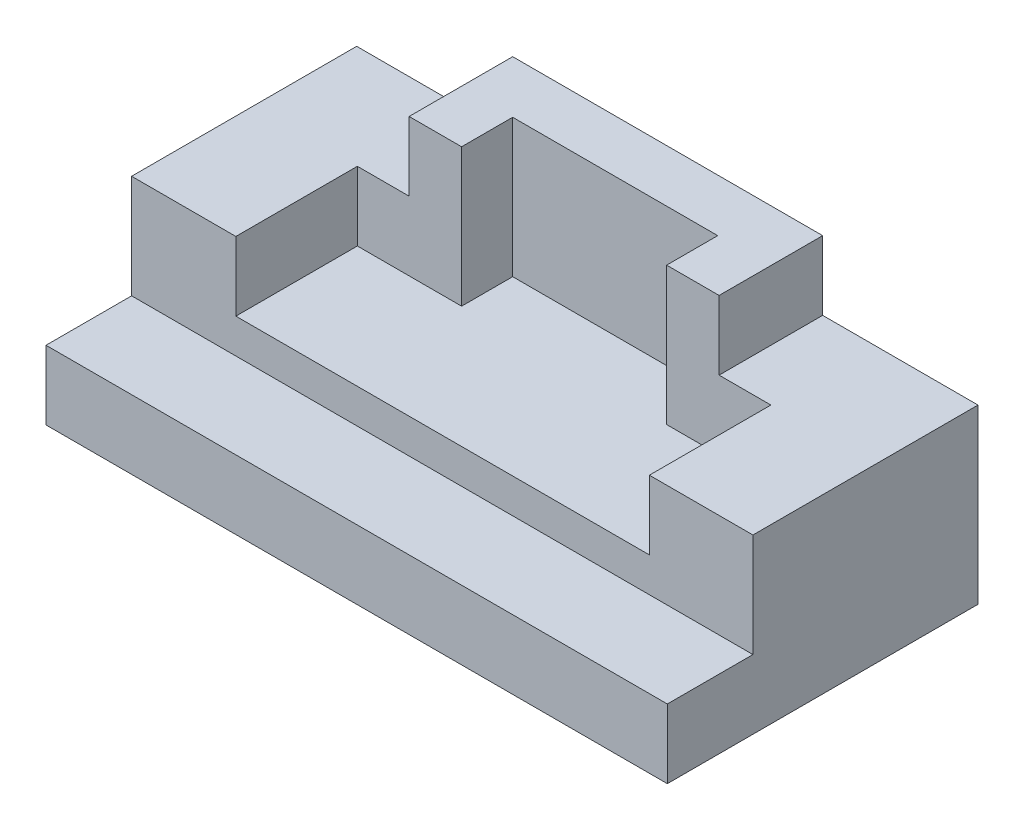
ISO-10303-21;
HEADER;
FILE_DESCRIPTION(('STEP AP214'),'2;1');
FILE_NAME('part.step','',(''),(''),'','','');
FILE_SCHEMA(('AUTOMOTIVE_DESIGN { 1 0 10303 214 1 1 1 1 }'));
ENDSEC;
DATA;
#1=APPLICATION_CONTEXT('core data for automotive mechanical design processes');
#2=APPLICATION_PROTOCOL_DEFINITION('international standard','automotive_design',2000,#1);
#3=PRODUCT_CONTEXT('',#1,'mechanical');
#4=PRODUCT('Part','Part','',(#3));
#5=PRODUCT_RELATED_PRODUCT_CATEGORY('part','',(#4));
#6=PRODUCT_DEFINITION_FORMATION('','',#4);
#7=PRODUCT_DEFINITION_CONTEXT('part definition',#1,'design');
#8=PRODUCT_DEFINITION('design','',#6,#7);
#9=PRODUCT_DEFINITION_SHAPE('','',#8);
#10=(LENGTH_UNIT() NAMED_UNIT(*) SI_UNIT(.MILLI.,.METRE.));
#11=(NAMED_UNIT(*) PLANE_ANGLE_UNIT() SI_UNIT($,.RADIAN.));
#12=(NAMED_UNIT(*) SI_UNIT($,.STERADIAN.) SOLID_ANGLE_UNIT());
#13=UNCERTAINTY_MEASURE_WITH_UNIT(LENGTH_MEASURE(1.E-05),#10,'distance_accuracy_value','');
#14=(GEOMETRIC_REPRESENTATION_CONTEXT(3) GLOBAL_UNCERTAINTY_ASSIGNED_CONTEXT((#13)) GLOBAL_UNIT_ASSIGNED_CONTEXT((#10,
#11,#12)) REPRESENTATION_CONTEXT('',''));
#15=CARTESIAN_POINT('',(0.,0.,0.));
#16=DIRECTION('',(0.,0.,1.));
#17=DIRECTION('',(1.,0.,0.));
#18=AXIS2_PLACEMENT_3D('',#15,#16,#17);
#19=CARTESIAN_POINT('',(57.15,31.75,-28.575));
#20=DIRECTION('',(0.,-1.,0.));
#21=DIRECTION('',(0.,0.,-1.));
#22=AXIS2_PLACEMENT_3D('',#19,#20,#21);
#23=PLANE('',#22);
#24=DIRECTION('',(0.,0.,-1.));
#25=VECTOR('',#24,1.);
#26=CARTESIAN_POINT('',(28.575,31.75,-28.575));
#27=LINE('',#26,#25);
#28=CARTESIAN_POINT('',(28.575,31.75,-9.52500000000001));
#29=VERTEX_POINT('',#28);
#30=CARTESIAN_POINT('',(28.575,31.75,-28.575));
#31=VERTEX_POINT('',#30);
#32=EDGE_CURVE('E213',#29,#31,#27,.T.);
#33=ORIENTED_EDGE('',*,*,#32,.F.);
#34=DIRECTION('',(1.,0.,0.));
#35=VECTOR('',#34,1.);
#36=CARTESIAN_POINT('',(57.15,31.75,-9.52500000000001));
#37=LINE('',#36,#35);
#38=CARTESIAN_POINT('',(38.1,31.75,-9.52500000000001));
#39=VERTEX_POINT('',#38);
#40=EDGE_CURVE('E197',#29,#39,#37,.T.);
#41=ORIENTED_EDGE('',*,*,#40,.T.);
#42=DIRECTION('',(0.,0.,1.));
#43=VECTOR('',#42,1.);
#44=CARTESIAN_POINT('',(38.1,31.75,-28.575));
#45=LINE('',#44,#43);
#46=CARTESIAN_POINT('',(38.1,31.75,12.827));
#47=VERTEX_POINT('',#46);
#48=EDGE_CURVE('E206',#39,#47,#45,.T.);
#49=ORIENTED_EDGE('',*,*,#48,.T.);
#50=DIRECTION('',(-1.,0.,0.));
#51=VECTOR('',#50,1.);
#52=CARTESIAN_POINT('',(57.15,31.75,12.827));
#53=LINE('',#52,#51);
#54=CARTESIAN_POINT('',(57.15,31.75,12.827));
#55=VERTEX_POINT('',#54);
#56=EDGE_CURVE('E288',#55,#47,#53,.T.);
#57=ORIENTED_EDGE('',*,*,#56,.F.);
#58=DIRECTION('',(0.,0.,1.));
#59=VECTOR('',#58,1.);
#60=CARTESIAN_POINT('',(57.15,31.75,-28.575));
#61=LINE('',#60,#59);
#62=CARTESIAN_POINT('',(57.15,31.75,-28.575));
#63=VERTEX_POINT('',#62);
#64=EDGE_CURVE('E253',#63,#55,#61,.T.);
#65=ORIENTED_EDGE('',*,*,#64,.F.);
#66=DIRECTION('',(-1.,0.,0.));
#67=VECTOR('',#66,1.);
#68=CARTESIAN_POINT('',(57.15,31.75,-28.575));
#69=LINE('',#68,#67);
#70=EDGE_CURVE('E11',#63,#31,#69,.T.);
#71=ORIENTED_EDGE('',*,*,#70,.T.);
#72=EDGE_LOOP('',(#33,#41,#49,#57,#65,#71));
#73=FACE_BOUND('',#72,.T.);
#74=ADVANCED_FACE('F33',(#73),#23,.F.);
#75=DIRECTION('',(0.,0.,-1.));
#76=VECTOR('',#75,1.);
#77=CARTESIAN_POINT('',(-37.973,31.75,-28.575));
#78=LINE('',#77,#76);
#79=CARTESIAN_POINT('',(-37.973,31.75,12.827));
#80=VERTEX_POINT('',#79);
#81=CARTESIAN_POINT('',(-37.973,31.75,-9.52500000000001));
#82=VERTEX_POINT('',#81);
#83=EDGE_CURVE('E204',#80,#82,#78,.T.);
#84=ORIENTED_EDGE('',*,*,#83,.T.);
#85=DIRECTION('',(1.,0.,0.));
#86=VECTOR('',#85,1.);
#87=CARTESIAN_POINT('',(57.15,31.75,-9.52499999999995));
#88=LINE('',#87,#86);
#89=CARTESIAN_POINT('',(-28.448,31.75,-9.525));
#90=VERTEX_POINT('',#89);
#91=EDGE_CURVE('E165',#82,#90,#88,.T.);
#92=ORIENTED_EDGE('',*,*,#91,.T.);
#93=DIRECTION('',(0.,0.,1.));
#94=VECTOR('',#93,1.);
#95=CARTESIAN_POINT('',(-28.448,31.75,-9.52499999999999));
#96=LINE('',#95,#94);
#97=CARTESIAN_POINT('',(-28.448,31.75,-28.575));
#98=VERTEX_POINT('',#97);
#99=EDGE_CURVE('E56',#98,#90,#96,.T.);
#100=ORIENTED_EDGE('',*,*,#99,.F.);
#101=CARTESIAN_POINT('',(-57.15,31.75,-28.575));
#102=VERTEX_POINT('',#101);
#103=EDGE_CURVE('E41',#98,#102,#69,.T.);
#104=ORIENTED_EDGE('',*,*,#103,.T.);
#105=DIRECTION('',(0.,0.,1.));
#106=VECTOR('',#105,1.);
#107=CARTESIAN_POINT('',(-57.15,31.75,-28.575));
#108=LINE('',#107,#106);
#109=CARTESIAN_POINT('',(-57.15,31.75,12.827));
#110=VERTEX_POINT('',#109);
#111=EDGE_CURVE('E267',#102,#110,#108,.T.);
#112=ORIENTED_EDGE('',*,*,#111,.T.);
#113=EDGE_CURVE('E287',#80,#110,#53,.T.);
#114=ORIENTED_EDGE('',*,*,#113,.F.);
#115=EDGE_LOOP('',(#84,#92,#100,#104,#112,#114));
#116=FACE_BOUND('',#115,.T.);
#117=ADVANCED_FACE('F299',(#116),#23,.F.);
#118=CARTESIAN_POINT('',(57.15,0.,-28.575));
#119=DIRECTION('',(0.,0.,1.));
#120=DIRECTION('',(1.,0.,0.));
#121=AXIS2_PLACEMENT_3D('',#118,#119,#120);
#122=PLANE('',#121);
#123=DIRECTION('',(0.,1.,0.));
#124=VECTOR('',#123,1.);
#125=CARTESIAN_POINT('',(-57.15,0.,-28.575));
#126=LINE('',#125,#124);
#127=CARTESIAN_POINT('',(-57.15,0.,-28.575));
#128=VERTEX_POINT('',#127);
#129=EDGE_CURVE('E249',#128,#102,#126,.T.);
#130=ORIENTED_EDGE('',*,*,#129,.T.);
#131=ORIENTED_EDGE('',*,*,#103,.F.);
#132=DIRECTION('',(0.,-1.,0.));
#133=VECTOR('',#132,1.);
#134=CARTESIAN_POINT('',(-28.448,44.45,-28.575));
#135=LINE('',#134,#133);
#136=CARTESIAN_POINT('',(-28.448,44.45,-28.575));
#137=VERTEX_POINT('',#136);
#138=EDGE_CURVE('E227',#137,#98,#135,.T.);
#139=ORIENTED_EDGE('',*,*,#138,.F.);
#140=DIRECTION('',(-1.,0.,0.));
#141=VECTOR('',#140,1.);
#142=CARTESIAN_POINT('',(-28.448,44.45,-28.575));
#143=LINE('',#142,#141);
#144=CARTESIAN_POINT('',(28.575,44.45,-28.575));
#145=VERTEX_POINT('',#144);
#146=EDGE_CURVE('E225',#145,#137,#143,.T.);
#147=ORIENTED_EDGE('',*,*,#146,.F.);
#148=DIRECTION('',(0.,-1.,0.));
#149=VECTOR('',#148,1.);
#150=CARTESIAN_POINT('',(28.575,44.45,-28.575));
#151=LINE('',#150,#149);
#152=EDGE_CURVE('E233',#145,#31,#151,.T.);
#153=ORIENTED_EDGE('',*,*,#152,.T.);
#154=ORIENTED_EDGE('',*,*,#70,.F.);
#155=DIRECTION('',(0.,1.,0.));
#156=VECTOR('',#155,1.);
#157=CARTESIAN_POINT('',(57.15,0.,-28.575));
#158=LINE('',#157,#156);
#159=CARTESIAN_POINT('',(57.15,0.,-28.575));
#160=VERTEX_POINT('',#159);
#161=EDGE_CURVE('E250',#160,#63,#158,.T.);
#162=ORIENTED_EDGE('',*,*,#161,.F.);
#163=DIRECTION('',(-1.,0.,0.));
#164=VECTOR('',#163,1.);
#165=CARTESIAN_POINT('',(57.15,0.,-28.575));
#166=LINE('',#165,#164);
#167=EDGE_CURVE('E264',#160,#128,#166,.T.);
#168=ORIENTED_EDGE('',*,*,#167,.T.);
#169=EDGE_LOOP('',(#130,#131,#139,#147,#153,#154,#162,#168));
#170=FACE_BOUND('',#169,.T.);
#171=ADVANCED_FACE('F35',(#170),#122,.F.);
#172=CARTESIAN_POINT('',(57.15,31.75,12.827));
#173=DIRECTION('',(0.,0.,-1.));
#174=DIRECTION('',(0.,1.,0.));
#175=AXIS2_PLACEMENT_3D('',#172,#173,#174);
#176=PLANE('',#175);
#177=ORIENTED_EDGE('',*,*,#56,.T.);
#178=DIRECTION('',(0.,1.,0.));
#179=VECTOR('',#178,1.);
#180=CARTESIAN_POINT('',(38.1,19.05,12.827));
#181=LINE('',#180,#179);
#182=CARTESIAN_POINT('',(38.1,19.05,12.827));
#183=VERTEX_POINT('',#182);
#184=EDGE_CURVE('E198',#183,#47,#181,.T.);
#185=ORIENTED_EDGE('',*,*,#184,.F.);
#186=DIRECTION('',(1.,0.,0.));
#187=VECTOR('',#186,1.);
#188=CARTESIAN_POINT('',(38.1,19.05,12.827));
#189=LINE('',#188,#187);
#190=CARTESIAN_POINT('',(-37.973,19.05,12.827));
#191=VERTEX_POINT('',#190);
#192=EDGE_CURVE('E174',#191,#183,#189,.T.);
#193=ORIENTED_EDGE('',*,*,#192,.F.);
#194=DIRECTION('',(0.,1.,0.));
#195=VECTOR('',#194,1.);
#196=CARTESIAN_POINT('',(-37.973,19.05,12.827));
#197=LINE('',#196,#195);
#198=EDGE_CURVE('E168',#191,#80,#197,.T.);
#199=ORIENTED_EDGE('',*,*,#198,.T.);
#200=ORIENTED_EDGE('',*,*,#113,.T.);
#201=DIRECTION('',(0.,-1.,0.));
#202=VECTOR('',#201,1.);
#203=CARTESIAN_POINT('',(-57.15,31.75,12.827));
#204=LINE('',#203,#202);
#205=CARTESIAN_POINT('',(-57.15,12.7,12.827));
#206=VERTEX_POINT('',#205);
#207=EDGE_CURVE('E270',#110,#206,#204,.T.);
#208=ORIENTED_EDGE('',*,*,#207,.T.);
#209=DIRECTION('',(-1.,0.,0.));
#210=VECTOR('',#209,1.);
#211=CARTESIAN_POINT('',(57.15,12.7,12.827));
#212=LINE('',#211,#210);
#213=CARTESIAN_POINT('',(57.15,12.7,12.827));
#214=VERTEX_POINT('',#213);
#215=EDGE_CURVE('E285',#214,#206,#212,.T.);
#216=ORIENTED_EDGE('',*,*,#215,.F.);
#217=DIRECTION('',(0.,-1.,0.));
#218=VECTOR('',#217,1.);
#219=CARTESIAN_POINT('',(57.15,31.75,12.827));
#220=LINE('',#219,#218);
#221=EDGE_CURVE('E256',#55,#214,#220,.T.);
#222=ORIENTED_EDGE('',*,*,#221,.F.);
#223=EDGE_LOOP('',(#177,#185,#193,#199,#200,#208,#216,#222));
#224=FACE_BOUND('',#223,.T.);
#225=ADVANCED_FACE('F295',(#224),#176,.F.);
#226=CARTESIAN_POINT('',(57.15,12.7,12.827));
#227=DIRECTION('',(0.,-1.,0.));
#228=DIRECTION('',(0.,0.,-1.));
#229=AXIS2_PLACEMENT_3D('',#226,#227,#228);
#230=PLANE('',#229);
#231=DIRECTION('',(0.,0.,1.));
#232=VECTOR('',#231,1.);
#233=CARTESIAN_POINT('',(-57.15,12.7,12.827));
#234=LINE('',#233,#232);
#235=CARTESIAN_POINT('',(-57.15,12.7,28.575));
#236=VERTEX_POINT('',#235);
#237=EDGE_CURVE('E272',#206,#236,#234,.T.);
#238=ORIENTED_EDGE('',*,*,#237,.T.);
#239=DIRECTION('',(-1.,0.,0.));
#240=VECTOR('',#239,1.);
#241=CARTESIAN_POINT('',(57.15,12.7,28.575));
#242=LINE('',#241,#240);
#243=CARTESIAN_POINT('',(57.15,12.7,28.575));
#244=VERTEX_POINT('',#243);
#245=EDGE_CURVE('E282',#244,#236,#242,.T.);
#246=ORIENTED_EDGE('',*,*,#245,.F.);
#247=DIRECTION('',(0.,0.,1.));
#248=VECTOR('',#247,1.);
#249=CARTESIAN_POINT('',(57.15,12.7,12.827));
#250=LINE('',#249,#248);
#251=EDGE_CURVE('E258',#214,#244,#250,.T.);
#252=ORIENTED_EDGE('',*,*,#251,.F.);
#253=ORIENTED_EDGE('',*,*,#215,.T.);
#254=EDGE_LOOP('',(#238,#246,#252,#253));
#255=FACE_BOUND('',#254,.T.);
#256=ADVANCED_FACE('F308',(#255),#230,.F.);
#257=CARTESIAN_POINT('',(57.15,12.7,28.575));
#258=DIRECTION('',(0.,0.,-1.));
#259=DIRECTION('',(0.,1.,0.));
#260=AXIS2_PLACEMENT_3D('',#257,#258,#259);
#261=PLANE('',#260);
#262=DIRECTION('',(0.,-1.,0.));
#263=VECTOR('',#262,1.);
#264=CARTESIAN_POINT('',(-57.15,12.7,28.575));
#265=LINE('',#264,#263);
#266=CARTESIAN_POINT('',(-57.15,0.,28.575));
#267=VERTEX_POINT('',#266);
#268=EDGE_CURVE('E274',#236,#267,#265,.T.);
#269=ORIENTED_EDGE('',*,*,#268,.T.);
#270=DIRECTION('',(-1.,0.,0.));
#271=VECTOR('',#270,1.);
#272=CARTESIAN_POINT('',(57.15,0.,28.575));
#273=LINE('',#272,#271);
#274=CARTESIAN_POINT('',(57.15,0.,28.575));
#275=VERTEX_POINT('',#274);
#276=EDGE_CURVE('E279',#275,#267,#273,.T.);
#277=ORIENTED_EDGE('',*,*,#276,.F.);
#278=DIRECTION('',(0.,-1.,0.));
#279=VECTOR('',#278,1.);
#280=CARTESIAN_POINT('',(57.15,12.7,28.575));
#281=LINE('',#280,#279);
#282=EDGE_CURVE('E260',#244,#275,#281,.T.);
#283=ORIENTED_EDGE('',*,*,#282,.F.);
#284=ORIENTED_EDGE('',*,*,#245,.T.);
#285=EDGE_LOOP('',(#269,#277,#283,#284));
#286=FACE_BOUND('',#285,.T.);
#287=ADVANCED_FACE('F312',(#286),#261,.F.);
#288=CARTESIAN_POINT('',(57.15,0.,28.575));
#289=DIRECTION('',(0.,1.,0.));
#290=DIRECTION('',(0.,0.,1.));
#291=AXIS2_PLACEMENT_3D('',#288,#289,#290);
#292=PLANE('',#291);
#293=DIRECTION('',(0.,0.,-1.));
#294=VECTOR('',#293,1.);
#295=CARTESIAN_POINT('',(-57.15,0.,28.575));
#296=LINE('',#295,#294);
#297=EDGE_CURVE('E254',#267,#128,#296,.T.);
#298=ORIENTED_EDGE('',*,*,#297,.T.);
#299=ORIENTED_EDGE('',*,*,#167,.F.);
#300=DIRECTION('',(0.,0.,-1.));
#301=VECTOR('',#300,1.);
#302=CARTESIAN_POINT('',(57.15,0.,28.575));
#303=LINE('',#302,#301);
#304=EDGE_CURVE('E262',#275,#160,#303,.T.);
#305=ORIENTED_EDGE('',*,*,#304,.F.);
#306=ORIENTED_EDGE('',*,*,#276,.T.);
#307=EDGE_LOOP('',(#298,#299,#305,#306));
#308=FACE_BOUND('',#307,.T.);
#309=ADVANCED_FACE('F353',(#308),#292,.F.);
#310=CARTESIAN_POINT('',(57.15,0.,0.));
#311=DIRECTION('',(1.,0.,0.));
#312=DIRECTION('',(0.,0.,-1.));
#313=AXIS2_PLACEMENT_3D('',#310,#311,#312);
#314=PLANE('',#313);
#315=ORIENTED_EDGE('',*,*,#161,.T.);
#316=ORIENTED_EDGE('',*,*,#64,.T.);
#317=ORIENTED_EDGE('',*,*,#221,.T.);
#318=ORIENTED_EDGE('',*,*,#251,.T.);
#319=ORIENTED_EDGE('',*,*,#282,.T.);
#320=ORIENTED_EDGE('',*,*,#304,.T.);
#321=EDGE_LOOP('',(#315,#316,#317,#318,#319,#320));
#322=FACE_BOUND('',#321,.T.);
#323=ADVANCED_FACE('F316',(#322),#314,.T.);
#324=CARTESIAN_POINT('',(-57.15,0.,0.));
#325=DIRECTION('',(1.,0.,0.));
#326=DIRECTION('',(0.,0.,-1.));
#327=AXIS2_PLACEMENT_3D('',#324,#325,#326);
#328=PLANE('',#327);
#329=ORIENTED_EDGE('',*,*,#129,.F.);
#330=ORIENTED_EDGE('',*,*,#297,.F.);
#331=ORIENTED_EDGE('',*,*,#268,.F.);
#332=ORIENTED_EDGE('',*,*,#237,.F.);
#333=ORIENTED_EDGE('',*,*,#207,.F.);
#334=ORIENTED_EDGE('',*,*,#111,.F.);
#335=EDGE_LOOP('',(#329,#330,#331,#332,#333,#334));
#336=FACE_BOUND('',#335,.T.);
#337=ADVANCED_FACE('F303',(#336),#328,.F.);
#338=CARTESIAN_POINT('',(-28.448,44.45,-9.52499999999999));
#339=DIRECTION('',(1.,0.,0.));
#340=DIRECTION('',(0.,0.,-1.));
#341=AXIS2_PLACEMENT_3D('',#338,#339,#340);
#342=PLANE('',#341);
#343=ORIENTED_EDGE('',*,*,#99,.T.);
#344=DIRECTION('',(0.,-1.,0.));
#345=VECTOR('',#344,1.);
#346=CARTESIAN_POINT('',(-28.448,44.45,-9.52499999999999));
#347=LINE('',#346,#345);
#348=CARTESIAN_POINT('',(-28.448,44.45,-9.52499999999999));
#349=VERTEX_POINT('',#348);
#350=EDGE_CURVE('E247',#349,#90,#347,.T.);
#351=ORIENTED_EDGE('',*,*,#350,.F.);
#352=DIRECTION('',(0.,0.,1.));
#353=VECTOR('',#352,1.);
#354=CARTESIAN_POINT('',(-28.448,44.45,-9.52499999999999));
#355=LINE('',#354,#353);
#356=EDGE_CURVE('E209',#137,#349,#355,.T.);
#357=ORIENTED_EDGE('',*,*,#356,.F.);
#358=ORIENTED_EDGE('',*,*,#138,.T.);
#359=EDGE_LOOP('',(#343,#351,#357,#358));
#360=FACE_BOUND('',#359,.T.);
#361=ADVANCED_FACE('F350',(#360),#342,.F.);
#362=CARTESIAN_POINT('',(-18.796,44.45,-9.52499999999999));
#363=DIRECTION('',(0.,0.,-1.));
#364=DIRECTION('',(-1.,0.,0.));
#365=AXIS2_PLACEMENT_3D('',#362,#363,#364);
#366=PLANE('',#365);
#367=ORIENTED_EDGE('',*,*,#350,.T.);
#368=ORIENTED_EDGE('',*,*,#91,.F.);
#369=DIRECTION('',(0.,1.,0.));
#370=VECTOR('',#369,1.);
#371=CARTESIAN_POINT('',(-37.973,19.05,-9.52500000000001));
#372=LINE('',#371,#370);
#373=CARTESIAN_POINT('',(-37.973,19.05,-9.52500000000001));
#374=VERTEX_POINT('',#373);
#375=EDGE_CURVE('E159',#374,#82,#372,.T.);
#376=ORIENTED_EDGE('',*,*,#375,.F.);
#377=DIRECTION('',(-1.,0.,0.));
#378=VECTOR('',#377,1.);
#379=CARTESIAN_POINT('',(-37.973,19.05,-9.52500000000001));
#380=LINE('',#379,#378);
#381=CARTESIAN_POINT('',(-18.796,19.05,-9.525));
#382=VERTEX_POINT('',#381);
#383=EDGE_CURVE('E163',#382,#374,#380,.T.);
#384=ORIENTED_EDGE('',*,*,#383,.F.);
#385=DIRECTION('',(0.,-1.,0.));
#386=VECTOR('',#385,1.);
#387=CARTESIAN_POINT('',(-18.796,44.45,-9.52499999999999));
#388=LINE('',#387,#386);
#389=CARTESIAN_POINT('',(-18.796,44.45,-9.52499999999999));
#390=VERTEX_POINT('',#389);
#391=EDGE_CURVE('E245',#390,#382,#388,.T.);
#392=ORIENTED_EDGE('',*,*,#391,.F.);
#393=DIRECTION('',(1.,0.,0.));
#394=VECTOR('',#393,1.);
#395=CARTESIAN_POINT('',(-18.796,44.45,-9.52499999999999));
#396=LINE('',#395,#394);
#397=EDGE_CURVE('E212',#349,#390,#396,.T.);
#398=ORIENTED_EDGE('',*,*,#397,.F.);
#399=EDGE_LOOP('',(#367,#368,#376,#384,#392,#398));
#400=FACE_BOUND('',#399,.T.);
#401=ADVANCED_FACE('F161',(#400),#366,.F.);
#402=CARTESIAN_POINT('',(-18.796,44.45,-18.923));
#403=DIRECTION('',(-1.,0.,0.));
#404=DIRECTION('',(0.,0.,1.));
#405=AXIS2_PLACEMENT_3D('',#402,#403,#404);
#406=PLANE('',#405);
#407=ORIENTED_EDGE('',*,*,#391,.T.);
#408=DIRECTION('',(0.,0.,1.));
#409=VECTOR('',#408,1.);
#410=CARTESIAN_POINT('',(-18.796,19.05,-9.525));
#411=LINE('',#410,#409);
#412=CARTESIAN_POINT('',(-18.796,19.05,-18.923));
#413=VERTEX_POINT('',#412);
#414=EDGE_CURVE('E169',#413,#382,#411,.T.);
#415=ORIENTED_EDGE('',*,*,#414,.F.);
#416=DIRECTION('',(0.,-1.,0.));
#417=VECTOR('',#416,1.);
#418=CARTESIAN_POINT('',(-18.796,44.45,-18.923));
#419=LINE('',#418,#417);
#420=CARTESIAN_POINT('',(-18.796,44.45,-18.923));
#421=VERTEX_POINT('',#420);
#422=EDGE_CURVE('E243',#421,#413,#419,.T.);
#423=ORIENTED_EDGE('',*,*,#422,.F.);
#424=DIRECTION('',(0.,0.,-1.));
#425=VECTOR('',#424,1.);
#426=CARTESIAN_POINT('',(-18.796,44.45,-18.923));
#427=LINE('',#426,#425);
#428=EDGE_CURVE('E215',#390,#421,#427,.T.);
#429=ORIENTED_EDGE('',*,*,#428,.F.);
#430=EDGE_LOOP('',(#407,#415,#423,#429));
#431=FACE_BOUND('',#430,.T.);
#432=ADVANCED_FACE('F342',(#431),#406,.F.);
#433=CARTESIAN_POINT('',(18.923,44.45,-18.923));
#434=DIRECTION('',(0.,0.,-1.));
#435=DIRECTION('',(0.,1.,0.));
#436=AXIS2_PLACEMENT_3D('',#433,#434,#435);
#437=PLANE('',#436);
#438=ORIENTED_EDGE('',*,*,#422,.T.);
#439=DIRECTION('',(-1.,0.,0.));
#440=VECTOR('',#439,1.);
#441=CARTESIAN_POINT('',(-18.796,19.05,-18.923));
#442=LINE('',#441,#440);
#443=CARTESIAN_POINT('',(18.923,19.05,-18.923));
#444=VERTEX_POINT('',#443);
#445=EDGE_CURVE('E191',#444,#413,#442,.T.);
#446=ORIENTED_EDGE('',*,*,#445,.F.);
#447=DIRECTION('',(0.,-1.,0.));
#448=VECTOR('',#447,1.);
#449=CARTESIAN_POINT('',(18.923,44.45,-18.923));
#450=LINE('',#449,#448);
#451=CARTESIAN_POINT('',(18.923,44.45,-18.923));
#452=VERTEX_POINT('',#451);
#453=EDGE_CURVE('E241',#452,#444,#450,.T.);
#454=ORIENTED_EDGE('',*,*,#453,.F.);
#455=DIRECTION('',(1.,0.,0.));
#456=VECTOR('',#455,1.);
#457=CARTESIAN_POINT('',(18.923,44.45,-18.923));
#458=LINE('',#457,#456);
#459=EDGE_CURVE('E217',#421,#452,#458,.T.);
#460=ORIENTED_EDGE('',*,*,#459,.F.);
#461=EDGE_LOOP('',(#438,#446,#454,#460));
#462=FACE_BOUND('',#461,.T.);
#463=ADVANCED_FACE('F338',(#462),#437,.F.);
#464=CARTESIAN_POINT('',(18.923,44.45,-9.52500000000001));
#465=DIRECTION('',(1.,0.,0.));
#466=DIRECTION('',(0.,0.,-1.));
#467=AXIS2_PLACEMENT_3D('',#464,#465,#466);
#468=PLANE('',#467);
#469=ORIENTED_EDGE('',*,*,#453,.T.);
#470=DIRECTION('',(0.,0.,-1.));
#471=VECTOR('',#470,1.);
#472=CARTESIAN_POINT('',(18.923,19.05,-18.923));
#473=LINE('',#472,#471);
#474=CARTESIAN_POINT('',(18.923,19.05,-9.52500000000001));
#475=VERTEX_POINT('',#474);
#476=EDGE_CURVE('E188',#475,#444,#473,.T.);
#477=ORIENTED_EDGE('',*,*,#476,.F.);
#478=DIRECTION('',(0.,-1.,0.));
#479=VECTOR('',#478,1.);
#480=CARTESIAN_POINT('',(18.923,44.45,-9.52500000000001));
#481=LINE('',#480,#479);
#482=CARTESIAN_POINT('',(18.923,44.45,-9.52500000000001));
#483=VERTEX_POINT('',#482);
#484=EDGE_CURVE('E239',#483,#475,#481,.T.);
#485=ORIENTED_EDGE('',*,*,#484,.F.);
#486=DIRECTION('',(0.,0.,1.));
#487=VECTOR('',#486,1.);
#488=CARTESIAN_POINT('',(18.923,44.45,-9.52500000000001));
#489=LINE('',#488,#487);
#490=EDGE_CURVE('E219',#452,#483,#489,.T.);
#491=ORIENTED_EDGE('',*,*,#490,.F.);
#492=EDGE_LOOP('',(#469,#477,#485,#491));
#493=FACE_BOUND('',#492,.T.);
#494=ADVANCED_FACE('F333',(#493),#468,.F.);
#495=CARTESIAN_POINT('',(28.575,44.45,-9.52500000000001));
#496=DIRECTION('',(0.,0.,-1.));
#497=DIRECTION('',(0.,1.,0.));
#498=AXIS2_PLACEMENT_3D('',#495,#496,#497);
#499=PLANE('',#498);
#500=ORIENTED_EDGE('',*,*,#484,.T.);
#501=DIRECTION('',(-1.,0.,0.));
#502=VECTOR('',#501,1.);
#503=CARTESIAN_POINT('',(18.923,19.05,-9.52500000000001));
#504=LINE('',#503,#502);
#505=CARTESIAN_POINT('',(38.1,19.05,-9.52500000000001));
#506=VERTEX_POINT('',#505);
#507=EDGE_CURVE('E185',#506,#475,#504,.T.);
#508=ORIENTED_EDGE('',*,*,#507,.F.);
#509=DIRECTION('',(0.,1.,0.));
#510=VECTOR('',#509,1.);
#511=CARTESIAN_POINT('',(38.1,19.05,-9.52500000000001));
#512=LINE('',#511,#510);
#513=EDGE_CURVE('E194',#506,#39,#512,.T.);
#514=ORIENTED_EDGE('',*,*,#513,.T.);
#515=ORIENTED_EDGE('',*,*,#40,.F.);
#516=DIRECTION('',(0.,-1.,0.));
#517=VECTOR('',#516,1.);
#518=CARTESIAN_POINT('',(28.575,44.45,-9.52500000000001));
#519=LINE('',#518,#517);
#520=CARTESIAN_POINT('',(28.575,44.45,-9.52500000000001));
#521=VERTEX_POINT('',#520);
#522=EDGE_CURVE('E236',#521,#29,#519,.T.);
#523=ORIENTED_EDGE('',*,*,#522,.F.);
#524=DIRECTION('',(1.,0.,0.));
#525=VECTOR('',#524,1.);
#526=CARTESIAN_POINT('',(28.575,44.45,-9.52500000000001));
#527=LINE('',#526,#525);
#528=EDGE_CURVE('E221',#483,#521,#527,.T.);
#529=ORIENTED_EDGE('',*,*,#528,.F.);
#530=EDGE_LOOP('',(#500,#508,#514,#515,#523,#529));
#531=FACE_BOUND('',#530,.T.);
#532=ADVANCED_FACE('F326',(#531),#499,.F.);
#533=CARTESIAN_POINT('',(28.575,44.45,-28.575));
#534=DIRECTION('',(-1.,0.,0.));
#535=DIRECTION('',(0.,0.,1.));
#536=AXIS2_PLACEMENT_3D('',#533,#534,#535);
#537=PLANE('',#536);
#538=ORIENTED_EDGE('',*,*,#32,.T.);
#539=ORIENTED_EDGE('',*,*,#152,.F.);
#540=DIRECTION('',(0.,0.,-1.));
#541=VECTOR('',#540,1.);
#542=CARTESIAN_POINT('',(28.575,44.45,-28.575));
#543=LINE('',#542,#541);
#544=EDGE_CURVE('E223',#521,#145,#543,.T.);
#545=ORIENTED_EDGE('',*,*,#544,.F.);
#546=ORIENTED_EDGE('',*,*,#522,.T.);
#547=EDGE_LOOP('',(#538,#539,#545,#546));
#548=FACE_BOUND('',#547,.T.);
#549=ADVANCED_FACE('F356',(#548),#537,.F.);
#550=CARTESIAN_POINT('',(0.,44.45,0.));
#551=DIRECTION('',(0.,-1.,0.));
#552=DIRECTION('',(0.,0.,-1.));
#553=AXIS2_PLACEMENT_3D('',#550,#551,#552);
#554=PLANE('',#553);
#555=ORIENTED_EDGE('',*,*,#356,.T.);
#556=ORIENTED_EDGE('',*,*,#397,.T.);
#557=ORIENTED_EDGE('',*,*,#428,.T.);
#558=ORIENTED_EDGE('',*,*,#459,.T.);
#559=ORIENTED_EDGE('',*,*,#490,.T.);
#560=ORIENTED_EDGE('',*,*,#528,.T.);
#561=ORIENTED_EDGE('',*,*,#544,.T.);
#562=ORIENTED_EDGE('',*,*,#146,.T.);
#563=EDGE_LOOP('',(#555,#556,#557,#558,#559,#560,#561,#562));
#564=FACE_BOUND('',#563,.T.);
#565=ADVANCED_FACE('F346',(#564),#554,.F.);
#566=CARTESIAN_POINT('',(38.1,19.05,-9.52500000000001));
#567=DIRECTION('',(1.,0.,0.));
#568=DIRECTION('',(0.,1.,0.));
#569=AXIS2_PLACEMENT_3D('',#566,#567,#568);
#570=PLANE('',#569);
#571=ORIENTED_EDGE('',*,*,#513,.F.);
#572=DIRECTION('',(0.,0.,-1.));
#573=VECTOR('',#572,1.);
#574=CARTESIAN_POINT('',(38.1,19.05,-9.52500000000001));
#575=LINE('',#574,#573);
#576=EDGE_CURVE('E182',#183,#506,#575,.T.);
#577=ORIENTED_EDGE('',*,*,#576,.F.);
#578=ORIENTED_EDGE('',*,*,#184,.T.);
#579=ORIENTED_EDGE('',*,*,#48,.F.);
#580=EDGE_LOOP('',(#571,#577,#578,#579));
#581=FACE_BOUND('',#580,.T.);
#582=ADVANCED_FACE('F323',(#581),#570,.F.);
#583=CARTESIAN_POINT('',(-37.973,19.05,12.827));
#584=DIRECTION('',(-1.,0.,0.));
#585=DIRECTION('',(0.,0.,1.));
#586=AXIS2_PLACEMENT_3D('',#583,#584,#585);
#587=PLANE('',#586);
#588=ORIENTED_EDGE('',*,*,#198,.F.);
#589=DIRECTION('',(0.,0.,1.));
#590=VECTOR('',#589,1.);
#591=CARTESIAN_POINT('',(-37.973,19.05,12.827));
#592=LINE('',#591,#590);
#593=EDGE_CURVE('E48',#374,#191,#592,.T.);
#594=ORIENTED_EDGE('',*,*,#593,.F.);
#595=ORIENTED_EDGE('',*,*,#375,.T.);
#596=ORIENTED_EDGE('',*,*,#83,.F.);
#597=EDGE_LOOP('',(#588,#594,#595,#596));
#598=FACE_BOUND('',#597,.T.);
#599=ADVANCED_FACE('F171',(#598),#587,.F.);
#600=CARTESIAN_POINT('',(0.,19.05,0.));
#601=DIRECTION('',(0.,1.,0.));
#602=DIRECTION('',(0.,0.,1.));
#603=AXIS2_PLACEMENT_3D('',#600,#601,#602);
#604=PLANE('',#603);
#605=ORIENTED_EDGE('',*,*,#383,.T.);
#606=ORIENTED_EDGE('',*,*,#593,.T.);
#607=ORIENTED_EDGE('',*,*,#192,.T.);
#608=ORIENTED_EDGE('',*,*,#576,.T.);
#609=ORIENTED_EDGE('',*,*,#507,.T.);
#610=ORIENTED_EDGE('',*,*,#476,.T.);
#611=ORIENTED_EDGE('',*,*,#445,.T.);
#612=ORIENTED_EDGE('',*,*,#414,.T.);
#613=EDGE_LOOP('',(#605,#606,#607,#608,#609,#610,#611,#612));
#614=FACE_BOUND('',#613,.T.);
#615=ADVANCED_FACE('F176',(#614),#604,.T.);
#616=CLOSED_SHELL('',(#74,#117,#171,#225,#256,#287,#309,#323,#337,#361,#401,#432,#463,#494,#532,
#549,#565,#582,#599,#615));
#617=MANIFOLD_SOLID_BREP('B2',#616);
#618=ADVANCED_BREP_SHAPE_REPRESENTATION('',(#18,#617),#14);
#619=SHAPE_DEFINITION_REPRESENTATION(#9,#618);
ENDSEC;
END-ISO-10303-21;
